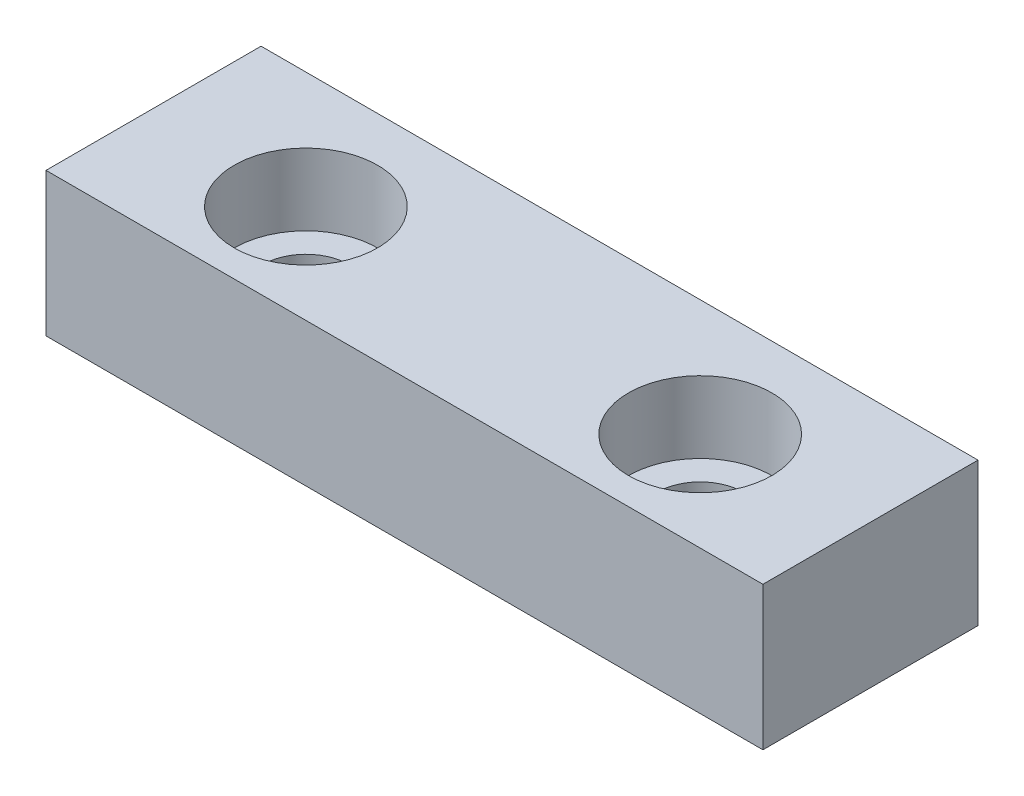
ISO-10303-21;
HEADER;
FILE_DESCRIPTION(('STEP AP214'),'2;1');
FILE_NAME('part.step','',(''),(''),'','','');
FILE_SCHEMA(('AUTOMOTIVE_DESIGN { 1 0 10303 214 1 1 1 1 }'));
ENDSEC;
DATA;
#1=APPLICATION_CONTEXT('core data for automotive mechanical design processes');
#2=APPLICATION_PROTOCOL_DEFINITION('international standard','automotive_design',2000,#1);
#3=PRODUCT_CONTEXT('',#1,'mechanical');
#4=PRODUCT('Part','Part','',(#3));
#5=PRODUCT_RELATED_PRODUCT_CATEGORY('part','',(#4));
#6=PRODUCT_DEFINITION_FORMATION('','',#4);
#7=PRODUCT_DEFINITION_CONTEXT('part definition',#1,'design');
#8=PRODUCT_DEFINITION('design','',#6,#7);
#9=PRODUCT_DEFINITION_SHAPE('','',#8);
#10=(LENGTH_UNIT() NAMED_UNIT(*) SI_UNIT(.MILLI.,.METRE.));
#11=(NAMED_UNIT(*) PLANE_ANGLE_UNIT() SI_UNIT($,.RADIAN.));
#12=(NAMED_UNIT(*) SI_UNIT($,.STERADIAN.) SOLID_ANGLE_UNIT());
#13=UNCERTAINTY_MEASURE_WITH_UNIT(LENGTH_MEASURE(1.E-05),#10,'distance_accuracy_value','');
#14=(GEOMETRIC_REPRESENTATION_CONTEXT(3) GLOBAL_UNCERTAINTY_ASSIGNED_CONTEXT((#13)) GLOBAL_UNIT_ASSIGNED_CONTEXT((#10,
#11,#12)) REPRESENTATION_CONTEXT('',''));
#15=CARTESIAN_POINT('',(0.,0.,0.));
#16=DIRECTION('',(0.,0.,1.));
#17=DIRECTION('',(1.,0.,0.));
#18=AXIS2_PLACEMENT_3D('',#15,#16,#17);
#19=CARTESIAN_POINT('',(0.,0.,12.));
#20=DIRECTION('',(1.,0.,0.));
#21=DIRECTION('',(0.,0.,-1.));
#22=AXIS2_PLACEMENT_3D('',#19,#20,#21);
#23=PLANE('',#22);
#24=DIRECTION('',(0.,-1.,0.));
#25=VECTOR('',#24,1.);
#26=CARTESIAN_POINT('',(0.,0.,0.));
#27=LINE('',#26,#25);
#28=CARTESIAN_POINT('',(0.,8.,0.));
#29=VERTEX_POINT('',#28);
#30=CARTESIAN_POINT('',(0.,0.,0.));
#31=VERTEX_POINT('',#30);
#32=EDGE_CURVE('E96',#29,#31,#27,.T.);
#33=ORIENTED_EDGE('',*,*,#32,.T.);
#34=DIRECTION('',(0.,0.,-1.));
#35=VECTOR('',#34,1.);
#36=CARTESIAN_POINT('',(0.,0.,12.));
#37=LINE('',#36,#35);
#38=CARTESIAN_POINT('',(0.,0.,12.));
#39=VERTEX_POINT('',#38);
#40=EDGE_CURVE('E11',#39,#31,#37,.T.);
#41=ORIENTED_EDGE('',*,*,#40,.F.);
#42=DIRECTION('',(0.,-1.,0.));
#43=VECTOR('',#42,1.);
#44=CARTESIAN_POINT('',(0.,0.,12.));
#45=LINE('',#44,#43);
#46=CARTESIAN_POINT('',(0.,8.,12.));
#47=VERTEX_POINT('',#46);
#48=EDGE_CURVE('E84',#47,#39,#45,.T.);
#49=ORIENTED_EDGE('',*,*,#48,.F.);
#50=DIRECTION('',(0.,0.,-1.));
#51=VECTOR('',#50,1.);
#52=CARTESIAN_POINT('',(0.,8.,12.));
#53=LINE('',#52,#51);
#54=EDGE_CURVE('E92',#47,#29,#53,.T.);
#55=ORIENTED_EDGE('',*,*,#54,.T.);
#56=EDGE_LOOP('',(#33,#41,#49,#55));
#57=FACE_BOUND('',#56,.T.);
#58=ADVANCED_FACE('F33',(#57),#23,.F.);
#59=CARTESIAN_POINT('',(0.,0.,12.));
#60=DIRECTION('',(0.,1.,0.));
#61=DIRECTION('',(0.,0.,1.));
#62=AXIS2_PLACEMENT_3D('',#59,#60,#61);
#63=PLANE('',#62);
#64=CARTESIAN_POINT('',(9.,0.,6.5));
#65=DIRECTION('',(0.,1.,0.));
#66=DIRECTION('',(0.,0.,1.));
#67=AXIS2_PLACEMENT_3D('',#64,#65,#66);
#68=CIRCLE('',#67,2.4);
#69=CARTESIAN_POINT('',(9.,0.,8.9));
#70=VERTEX_POINT('',#69);
#71=EDGE_CURVE('E121',#70,#70,#68,.T.);
#72=ORIENTED_EDGE('',*,*,#71,.T.);
#73=EDGE_LOOP('',(#72));
#74=FACE_BOUND('',#73,.T.);
#75=CARTESIAN_POINT('',(31.,0.,6.5));
#76=DIRECTION('',(0.,1.,0.));
#77=DIRECTION('',(0.,0.,1.));
#78=AXIS2_PLACEMENT_3D('',#75,#76,#77);
#79=CIRCLE('',#78,2.4);
#80=CARTESIAN_POINT('',(31.,0.,8.9));
#81=VERTEX_POINT('',#80);
#82=EDGE_CURVE('E99',#81,#81,#79,.T.);
#83=ORIENTED_EDGE('',*,*,#82,.T.);
#84=EDGE_LOOP('',(#83));
#85=FACE_BOUND('',#84,.T.);
#86=DIRECTION('',(1.,0.,0.));
#87=VECTOR('',#86,1.);
#88=CARTESIAN_POINT('',(0.,0.,0.));
#89=LINE('',#88,#87);
#90=CARTESIAN_POINT('',(40.,0.,0.));
#91=VERTEX_POINT('',#90);
#92=EDGE_CURVE('E88',#31,#91,#89,.T.);
#93=ORIENTED_EDGE('',*,*,#92,.T.);
#94=DIRECTION('',(0.,0.,-1.));
#95=VECTOR('',#94,1.);
#96=CARTESIAN_POINT('',(40.,0.,12.));
#97=LINE('',#96,#95);
#98=CARTESIAN_POINT('',(40.,0.,12.));
#99=VERTEX_POINT('',#98);
#100=EDGE_CURVE('E41',#99,#91,#97,.T.);
#101=ORIENTED_EDGE('',*,*,#100,.F.);
#102=DIRECTION('',(1.,0.,0.));
#103=VECTOR('',#102,1.);
#104=CARTESIAN_POINT('',(0.,0.,12.));
#105=LINE('',#104,#103);
#106=EDGE_CURVE('E79',#39,#99,#105,.T.);
#107=ORIENTED_EDGE('',*,*,#106,.F.);
#108=ORIENTED_EDGE('',*,*,#40,.T.);
#109=EDGE_LOOP('',(#93,#101,#107,#108));
#110=FACE_BOUND('',#109,.T.);
#111=ADVANCED_FACE('F87',(#74,#85,#110),#63,.F.);
#112=CARTESIAN_POINT('',(40.,0.,12.));
#113=DIRECTION('',(-1.,0.,0.));
#114=DIRECTION('',(0.,0.,1.));
#115=AXIS2_PLACEMENT_3D('',#112,#113,#114);
#116=PLANE('',#115);
#117=DIRECTION('',(0.,1.,0.));
#118=VECTOR('',#117,1.);
#119=CARTESIAN_POINT('',(40.,0.,0.));
#120=LINE('',#119,#118);
#121=CARTESIAN_POINT('',(40.,8.,0.));
#122=VERTEX_POINT('',#121);
#123=EDGE_CURVE('E66',#91,#122,#120,.T.);
#124=ORIENTED_EDGE('',*,*,#123,.T.);
#125=DIRECTION('',(0.,0.,-1.));
#126=VECTOR('',#125,1.);
#127=CARTESIAN_POINT('',(40.,8.,12.));
#128=LINE('',#127,#126);
#129=CARTESIAN_POINT('',(40.,8.,12.));
#130=VERTEX_POINT('',#129);
#131=EDGE_CURVE('E89',#130,#122,#128,.T.);
#132=ORIENTED_EDGE('',*,*,#131,.F.);
#133=DIRECTION('',(0.,1.,0.));
#134=VECTOR('',#133,1.);
#135=CARTESIAN_POINT('',(40.,0.,12.));
#136=LINE('',#135,#134);
#137=EDGE_CURVE('E82',#99,#130,#136,.T.);
#138=ORIENTED_EDGE('',*,*,#137,.F.);
#139=ORIENTED_EDGE('',*,*,#100,.T.);
#140=EDGE_LOOP('',(#124,#132,#138,#139));
#141=FACE_BOUND('',#140,.T.);
#142=ADVANCED_FACE('F90',(#141),#116,.F.);
#143=CARTESIAN_POINT('',(0.,8.,12.));
#144=DIRECTION('',(0.,-1.,0.));
#145=DIRECTION('',(0.,0.,-1.));
#146=AXIS2_PLACEMENT_3D('',#143,#144,#145);
#147=PLANE('',#146);
#148=CARTESIAN_POINT('',(9.,8.,6.5));
#149=DIRECTION('',(0.,1.,0.));
#150=DIRECTION('',(0.,0.,1.));
#151=AXIS2_PLACEMENT_3D('',#148,#149,#150);
#152=CIRCLE('',#151,4.);
#153=CARTESIAN_POINT('',(9.,8.,10.5));
#154=VERTEX_POINT('',#153);
#155=EDGE_CURVE('E130',#154,#154,#152,.T.);
#156=ORIENTED_EDGE('',*,*,#155,.F.);
#157=EDGE_LOOP('',(#156));
#158=FACE_BOUND('',#157,.T.);
#159=CARTESIAN_POINT('',(31.,8.,6.5));
#160=DIRECTION('',(0.,1.,0.));
#161=DIRECTION('',(0.,0.,1.));
#162=AXIS2_PLACEMENT_3D('',#159,#160,#161);
#163=CIRCLE('',#162,4.);
#164=CARTESIAN_POINT('',(31.,8.,10.5));
#165=VERTEX_POINT('',#164);
#166=EDGE_CURVE('E118',#165,#165,#163,.T.);
#167=ORIENTED_EDGE('',*,*,#166,.F.);
#168=EDGE_LOOP('',(#167));
#169=FACE_BOUND('',#168,.T.);
#170=DIRECTION('',(-1.,0.,0.));
#171=VECTOR('',#170,1.);
#172=CARTESIAN_POINT('',(0.,8.,0.));
#173=LINE('',#172,#171);
#174=EDGE_CURVE('E72',#122,#29,#173,.T.);
#175=ORIENTED_EDGE('',*,*,#174,.T.);
#176=ORIENTED_EDGE('',*,*,#54,.F.);
#177=DIRECTION('',(-1.,0.,0.));
#178=VECTOR('',#177,1.);
#179=CARTESIAN_POINT('',(0.,8.,12.));
#180=LINE('',#179,#178);
#181=EDGE_CURVE('E49',#130,#47,#180,.T.);
#182=ORIENTED_EDGE('',*,*,#181,.F.);
#183=ORIENTED_EDGE('',*,*,#131,.T.);
#184=EDGE_LOOP('',(#175,#176,#182,#183));
#185=FACE_BOUND('',#184,.T.);
#186=ADVANCED_FACE('F104',(#158,#169,#185),#147,.F.);
#187=CARTESIAN_POINT('',(0.,8.,12.));
#188=DIRECTION('',(0.,0.,-1.));
#189=DIRECTION('',(-1.,0.,0.));
#190=AXIS2_PLACEMENT_3D('',#187,#188,#189);
#191=PLANE('',#190);
#192=ORIENTED_EDGE('',*,*,#48,.T.);
#193=ORIENTED_EDGE('',*,*,#106,.T.);
#194=ORIENTED_EDGE('',*,*,#137,.T.);
#195=ORIENTED_EDGE('',*,*,#181,.T.);
#196=EDGE_LOOP('',(#192,#193,#194,#195));
#197=FACE_BOUND('',#196,.T.);
#198=ADVANCED_FACE('F80',(#197),#191,.F.);
#199=CARTESIAN_POINT('',(0.,8.,0.));
#200=DIRECTION('',(0.,0.,-1.));
#201=DIRECTION('',(-1.,0.,0.));
#202=AXIS2_PLACEMENT_3D('',#199,#200,#201);
#203=PLANE('',#202);
#204=ORIENTED_EDGE('',*,*,#32,.F.);
#205=ORIENTED_EDGE('',*,*,#174,.F.);
#206=ORIENTED_EDGE('',*,*,#123,.F.);
#207=ORIENTED_EDGE('',*,*,#92,.F.);
#208=EDGE_LOOP('',(#204,#205,#206,#207));
#209=FACE_BOUND('',#208,.T.);
#210=ADVANCED_FACE('F107',(#209),#203,.T.);
#211=CARTESIAN_POINT('',(31.,8.,6.5));
#212=DIRECTION('',(0.,1.,0.));
#213=DIRECTION('',(0.,0.,1.));
#214=AXIS2_PLACEMENT_3D('',#211,#212,#213);
#215=CYLINDRICAL_SURFACE('',#214,2.4);
#216=ORIENTED_EDGE('',*,*,#82,.F.);
#217=EDGE_LOOP('',(#216));
#218=FACE_BOUND('',#217,.T.);
#219=CARTESIAN_POINT('',(31.,4.,6.5));
#220=DIRECTION('',(0.,1.,0.));
#221=DIRECTION('',(0.,0.,1.));
#222=AXIS2_PLACEMENT_3D('',#219,#220,#221);
#223=CIRCLE('',#222,2.4);
#224=CARTESIAN_POINT('',(31.,4.,8.9));
#225=VERTEX_POINT('',#224);
#226=EDGE_CURVE('E112',#225,#225,#223,.T.);
#227=ORIENTED_EDGE('',*,*,#226,.T.);
#228=EDGE_LOOP('',(#227));
#229=FACE_BOUND('',#228,.T.);
#230=ADVANCED_FACE('F154',(#218,#229),#215,.F.);
#231=CARTESIAN_POINT('',(33.4,4.,6.5));
#232=DIRECTION('',(0.,-1.,0.));
#233=DIRECTION('',(0.,0.,-1.));
#234=AXIS2_PLACEMENT_3D('',#231,#232,#233);
#235=PLANE('',#234);
#236=ORIENTED_EDGE('',*,*,#226,.F.);
#237=EDGE_LOOP('',(#236));
#238=FACE_BOUND('',#237,.T.);
#239=CARTESIAN_POINT('',(31.,4.,6.5));
#240=DIRECTION('',(0.,1.,0.));
#241=DIRECTION('',(0.,0.,1.));
#242=AXIS2_PLACEMENT_3D('',#239,#240,#241);
#243=CIRCLE('',#242,4.);
#244=CARTESIAN_POINT('',(31.,4.,10.5));
#245=VERTEX_POINT('',#244);
#246=EDGE_CURVE('E115',#245,#245,#243,.T.);
#247=ORIENTED_EDGE('',*,*,#246,.T.);
#248=EDGE_LOOP('',(#247));
#249=FACE_BOUND('',#248,.T.);
#250=ADVANCED_FACE('F144',(#238,#249),#235,.F.);
#251=CARTESIAN_POINT('',(31.,8.,6.5));
#252=DIRECTION('',(0.,1.,0.));
#253=DIRECTION('',(0.,0.,1.));
#254=AXIS2_PLACEMENT_3D('',#251,#252,#253);
#255=CYLINDRICAL_SURFACE('',#254,4.);
#256=ORIENTED_EDGE('',*,*,#246,.F.);
#257=EDGE_LOOP('',(#256));
#258=FACE_BOUND('',#257,.T.);
#259=ORIENTED_EDGE('',*,*,#166,.T.);
#260=EDGE_LOOP('',(#259));
#261=FACE_BOUND('',#260,.T.);
#262=ADVANCED_FACE('F141',(#258,#261),#255,.F.);
#263=CARTESIAN_POINT('',(9.,8.,6.5));
#264=DIRECTION('',(0.,1.,0.));
#265=DIRECTION('',(0.,0.,1.));
#266=AXIS2_PLACEMENT_3D('',#263,#264,#265);
#267=CYLINDRICAL_SURFACE('',#266,2.4);
#268=ORIENTED_EDGE('',*,*,#71,.F.);
#269=EDGE_LOOP('',(#268));
#270=FACE_BOUND('',#269,.T.);
#271=CARTESIAN_POINT('',(9.,4.,6.5));
#272=DIRECTION('',(0.,1.,0.));
#273=DIRECTION('',(0.,0.,1.));
#274=AXIS2_PLACEMENT_3D('',#271,#272,#273);
#275=CIRCLE('',#274,2.4);
#276=CARTESIAN_POINT('',(9.,4.,8.9));
#277=VERTEX_POINT('',#276);
#278=EDGE_CURVE('E124',#277,#277,#275,.T.);
#279=ORIENTED_EDGE('',*,*,#278,.T.);
#280=EDGE_LOOP('',(#279));
#281=FACE_BOUND('',#280,.T.);
#282=ADVANCED_FACE('F143',(#270,#281),#267,.F.);
#283=CARTESIAN_POINT('',(11.4,4.,6.5));
#284=DIRECTION('',(0.,-1.,0.));
#285=DIRECTION('',(0.,0.,-1.));
#286=AXIS2_PLACEMENT_3D('',#283,#284,#285);
#287=PLANE('',#286);
#288=ORIENTED_EDGE('',*,*,#278,.F.);
#289=EDGE_LOOP('',(#288));
#290=FACE_BOUND('',#289,.T.);
#291=CARTESIAN_POINT('',(9.,4.,6.5));
#292=DIRECTION('',(0.,1.,0.));
#293=DIRECTION('',(0.,0.,1.));
#294=AXIS2_PLACEMENT_3D('',#291,#292,#293);
#295=CIRCLE('',#294,4.);
#296=CARTESIAN_POINT('',(9.,4.,10.5));
#297=VERTEX_POINT('',#296);
#298=EDGE_CURVE('E127',#297,#297,#295,.T.);
#299=ORIENTED_EDGE('',*,*,#298,.T.);
#300=EDGE_LOOP('',(#299));
#301=FACE_BOUND('',#300,.T.);
#302=ADVANCED_FACE('F151',(#290,#301),#287,.F.);
#303=CARTESIAN_POINT('',(9.,8.,6.5));
#304=DIRECTION('',(0.,1.,0.));
#305=DIRECTION('',(0.,0.,1.));
#306=AXIS2_PLACEMENT_3D('',#303,#304,#305);
#307=CYLINDRICAL_SURFACE('',#306,4.);
#308=ORIENTED_EDGE('',*,*,#298,.F.);
#309=EDGE_LOOP('',(#308));
#310=FACE_BOUND('',#309,.T.);
#311=ORIENTED_EDGE('',*,*,#155,.T.);
#312=EDGE_LOOP('',(#311));
#313=FACE_BOUND('',#312,.T.);
#314=ADVANCED_FACE('F134',(#310,#313),#307,.F.);
#315=CLOSED_SHELL('',(#58,#111,#142,#186,#198,#210,#230,#250,#262,#282,#302,#314));
#316=MANIFOLD_SOLID_BREP('B2',#315);
#317=ADVANCED_BREP_SHAPE_REPRESENTATION('',(#18,#316),#14);
#318=SHAPE_DEFINITION_REPRESENTATION(#9,#317);
ENDSEC;
END-ISO-10303-21;
